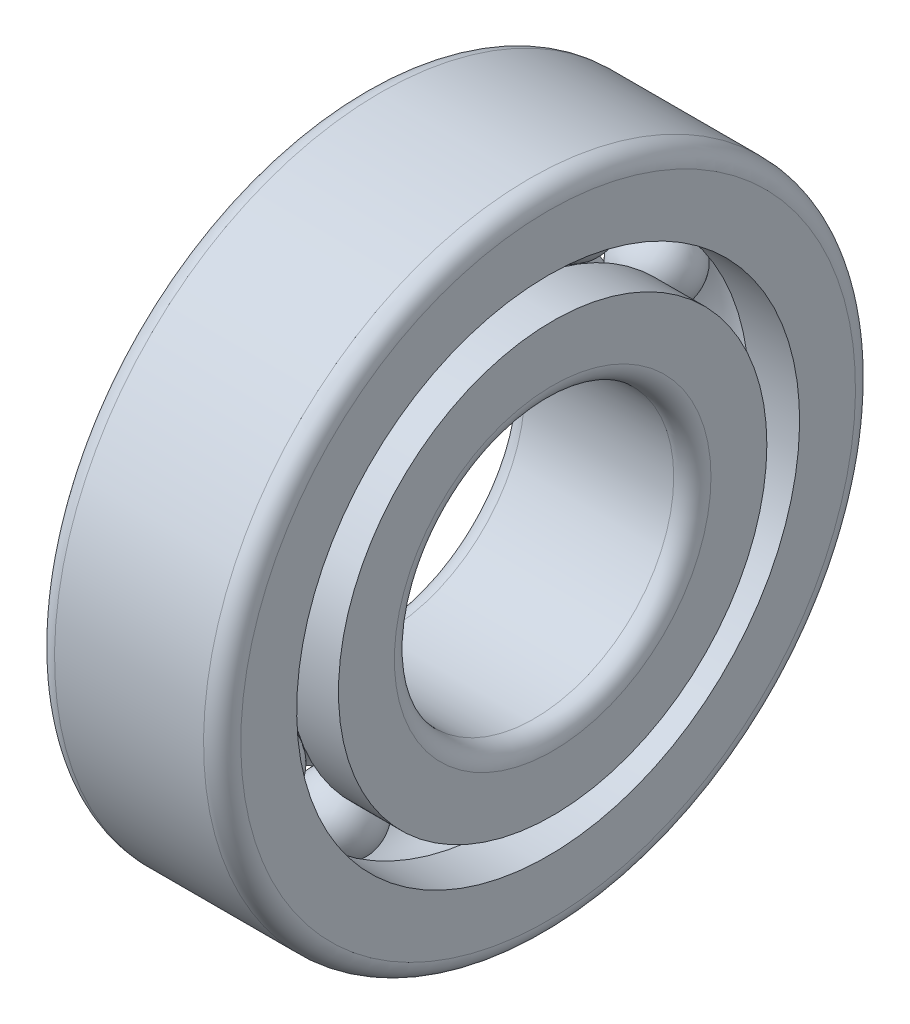
ISO-10303-21;
HEADER;
FILE_DESCRIPTION(('STEP AP214'),'2;1');
FILE_NAME('part.step','',(''),(''),'','','');
FILE_SCHEMA(('AUTOMOTIVE_DESIGN { 1 0 10303 214 1 1 1 1 }'));
ENDSEC;
DATA;
#1=APPLICATION_CONTEXT('core data for automotive mechanical design processes');
#2=APPLICATION_PROTOCOL_DEFINITION('international standard','automotive_design',2000,#1);
#3=PRODUCT_CONTEXT('',#1,'mechanical');
#4=PRODUCT('Part','Part','',(#3));
#5=PRODUCT_RELATED_PRODUCT_CATEGORY('part','',(#4));
#6=PRODUCT_DEFINITION_FORMATION('','',#4);
#7=PRODUCT_DEFINITION_CONTEXT('part definition',#1,'design');
#8=PRODUCT_DEFINITION('design','',#6,#7);
#9=PRODUCT_DEFINITION_SHAPE('','',#8);
#10=(LENGTH_UNIT() NAMED_UNIT(*) SI_UNIT(.MILLI.,.METRE.));
#11=(NAMED_UNIT(*) PLANE_ANGLE_UNIT() SI_UNIT($,.RADIAN.));
#12=(NAMED_UNIT(*) SI_UNIT($,.STERADIAN.) SOLID_ANGLE_UNIT());
#13=UNCERTAINTY_MEASURE_WITH_UNIT(LENGTH_MEASURE(1.E-05),#10,'distance_accuracy_value','');
#14=(GEOMETRIC_REPRESENTATION_CONTEXT(3) GLOBAL_UNCERTAINTY_ASSIGNED_CONTEXT((#13)) GLOBAL_UNIT_ASSIGNED_CONTEXT((#10,
#11,#12)) REPRESENTATION_CONTEXT('',''));
#15=CARTESIAN_POINT('',(0.,0.,0.));
#16=DIRECTION('',(0.,0.,1.));
#17=DIRECTION('',(1.,0.,0.));
#18=AXIS2_PLACEMENT_3D('',#15,#16,#17);
#19=CARTESIAN_POINT('',(0.,6.2499999999999,-10.8253175473055));
#20=DIRECTION('',(1.,0.,0.));
#21=DIRECTION('',(0.,-0.499999999999992,0.866025403784443));
#22=AXIS2_PLACEMENT_3D('',#19,#20,#21);
#23=SPHERICAL_SURFACE('',#22,2.);
#24=CARTESIAN_POINT('',(2.,6.2499999999999,-10.8253175473055));
#25=VERTEX_POINT('',#24);
#26=VERTEX_LOOP('',#25);
#27=FACE_BOUND('',#26,.T.);
#28=ADVANCED_FACE('P0_F13',(#27),#23,.T.);
#29=CLOSED_SHELL('',(#28));
#30=MANIFOLD_SOLID_BREP('P0_B1',#29);
#31=CARTESIAN_POINT('',(0.,-1.30930550206618E-13,-12.5));
#32=DIRECTION('',(1.,0.,0.));
#33=DIRECTION('',(0.,0.,1.));
#34=AXIS2_PLACEMENT_3D('',#31,#32,#33);
#35=SPHERICAL_SURFACE('',#34,2.);
#36=CARTESIAN_POINT('',(2.,-1.30930550206618E-13,-12.5));
#37=VERTEX_POINT('',#36);
#38=VERTEX_LOOP('',#37);
#39=FACE_BOUND('',#38,.T.);
#40=ADVANCED_FACE('P1_F13',(#39),#35,.T.);
#41=CLOSED_SHELL('',(#40));
#42=MANIFOLD_SOLID_BREP('P1_B1',#41);
#43=CARTESIAN_POINT('',(0.,-6.25000000000013,-10.8253175473054));
#44=DIRECTION('',(1.,0.,0.));
#45=DIRECTION('',(0.,0.50000000000001,0.866025403784433));
#46=AXIS2_PLACEMENT_3D('',#43,#44,#45);
#47=SPHERICAL_SURFACE('',#46,2.);
#48=CARTESIAN_POINT('',(2.,-6.25000000000013,-10.8253175473054));
#49=VERTEX_POINT('',#48);
#50=VERTEX_LOOP('',#49);
#51=FACE_BOUND('',#50,.T.);
#52=ADVANCED_FACE('P2_F13',(#51),#47,.T.);
#53=CLOSED_SHELL('',(#52));
#54=MANIFOLD_SOLID_BREP('P2_B1',#53);
#55=CARTESIAN_POINT('',(0.,-10.8253175473056,-6.24999999999986));
#56=DIRECTION('',(1.,0.,0.));
#57=DIRECTION('',(0.,0.866025403784445,0.499999999999989));
#58=AXIS2_PLACEMENT_3D('',#55,#56,#57);
#59=SPHERICAL_SURFACE('',#58,2.);
#60=CARTESIAN_POINT('',(2.,-10.8253175473056,-6.24999999999986));
#61=VERTEX_POINT('',#60);
#62=VERTEX_LOOP('',#61);
#63=FACE_BOUND('',#62,.T.);
#64=ADVANCED_FACE('P3_F12',(#63),#59,.T.);
#65=CLOSED_SHELL('',(#64));
#66=MANIFOLD_SOLID_BREP('P3_B1',#65);
#67=CARTESIAN_POINT('',(0.,-12.5,0.));
#68=DIRECTION('',(1.,0.,0.));
#69=DIRECTION('',(0.,1.,0.));
#70=AXIS2_PLACEMENT_3D('',#67,#68,#69);
#71=SPHERICAL_SURFACE('',#70,2.);
#72=CARTESIAN_POINT('',(2.,-12.5,0.));
#73=VERTEX_POINT('',#72);
#74=VERTEX_LOOP('',#73);
#75=FACE_BOUND('',#74,.T.);
#76=ADVANCED_FACE('P4_F13',(#75),#71,.T.);
#77=CLOSED_SHELL('',(#76));
#78=MANIFOLD_SOLID_BREP('P4_B1',#77);
#79=CARTESIAN_POINT('',(0.,-10.8253175473055,6.25000000000001));
#80=DIRECTION('',(1.,0.,0.));
#81=DIRECTION('',(0.,0.866025403784438,-0.500000000000001));
#82=AXIS2_PLACEMENT_3D('',#79,#80,#81);
#83=SPHERICAL_SURFACE('',#82,2.);
#84=CARTESIAN_POINT('',(2.,-10.8253175473055,6.25000000000001));
#85=VERTEX_POINT('',#84);
#86=VERTEX_LOOP('',#85);
#87=FACE_BOUND('',#86,.T.);
#88=ADVANCED_FACE('P5_F13',(#87),#83,.T.);
#89=CLOSED_SHELL('',(#88));
#90=MANIFOLD_SOLID_BREP('P5_B1',#89);
#91=CARTESIAN_POINT('',(0.,-6.24999999999998,10.8253175473055));
#92=DIRECTION('',(1.,0.,0.));
#93=DIRECTION('',(0.,0.499999999999998,-0.86602540378444));
#94=AXIS2_PLACEMENT_3D('',#91,#92,#93);
#95=SPHERICAL_SURFACE('',#94,2.);
#96=CARTESIAN_POINT('',(2.,-6.24999999999998,10.8253175473055));
#97=VERTEX_POINT('',#96);
#98=VERTEX_LOOP('',#97);
#99=FACE_BOUND('',#98,.T.);
#100=ADVANCED_FACE('P6_F13',(#99),#95,.T.);
#101=CLOSED_SHELL('',(#100));
#102=MANIFOLD_SOLID_BREP('P6_B1',#101);
#103=CARTESIAN_POINT('',(0.,0.,12.5));
#104=DIRECTION('',(1.,0.,0.));
#105=DIRECTION('',(0.,0.,-1.));
#106=AXIS2_PLACEMENT_3D('',#103,#104,#105);
#107=SPHERICAL_SURFACE('',#106,2.);
#108=CARTESIAN_POINT('',(2.,0.,12.5));
#109=VERTEX_POINT('',#108);
#110=VERTEX_LOOP('',#109);
#111=FACE_BOUND('',#110,.T.);
#112=ADVANCED_FACE('P7_F13',(#111),#107,.T.);
#113=CLOSED_SHELL('',(#112));
#114=MANIFOLD_SOLID_BREP('P7_B1',#113);
#115=CARTESIAN_POINT('',(0.,6.25000000000005,10.8253175473055));
#116=DIRECTION('',(1.,0.,0.));
#117=DIRECTION('',(0.,-0.500000000000004,-0.866025403784436));
#118=AXIS2_PLACEMENT_3D('',#115,#116,#117);
#119=SPHERICAL_SURFACE('',#118,2.);
#120=CARTESIAN_POINT('',(2.,6.25000000000005,10.8253175473055));
#121=VERTEX_POINT('',#120);
#122=VERTEX_LOOP('',#121);
#123=FACE_BOUND('',#122,.T.);
#124=ADVANCED_FACE('P8_F13',(#123),#119,.T.);
#125=CLOSED_SHELL('',(#124));
#126=MANIFOLD_SOLID_BREP('P8_B1',#125);
#127=CARTESIAN_POINT('',(0.,10.8253175473055,6.24999999999994));
#128=DIRECTION('',(1.,0.,0.));
#129=DIRECTION('',(0.,-0.866025403784442,-0.499999999999995));
#130=AXIS2_PLACEMENT_3D('',#127,#128,#129);
#131=SPHERICAL_SURFACE('',#130,2.);
#132=CARTESIAN_POINT('',(2.,10.8253175473055,6.24999999999994));
#133=VERTEX_POINT('',#132);
#134=VERTEX_LOOP('',#133);
#135=FACE_BOUND('',#134,.T.);
#136=ADVANCED_FACE('P9_F13',(#135),#131,.T.);
#137=CLOSED_SHELL('',(#136));
#138=MANIFOLD_SOLID_BREP('P9_B1',#137);
#139=CARTESIAN_POINT('',(0.,12.5,0.));
#140=DIRECTION('',(1.,0.,0.));
#141=DIRECTION('',(0.,-1.,0.));
#142=AXIS2_PLACEMENT_3D('',#139,#140,#141);
#143=SPHERICAL_SURFACE('',#142,2.);
#144=CARTESIAN_POINT('',(2.,12.5,0.));
#145=VERTEX_POINT('',#144);
#146=VERTEX_LOOP('',#145);
#147=FACE_BOUND('',#146,.T.);
#148=ADVANCED_FACE('P10_F13',(#147),#143,.T.);
#149=CLOSED_SHELL('',(#148));
#150=MANIFOLD_SOLID_BREP('P10_B1',#149);
#151=CARTESIAN_POINT('',(0.,10.8253175473054,-6.25000000000009));
#152=DIRECTION('',(1.,0.,0.));
#153=DIRECTION('',(0.,-0.866025403784435,0.500000000000007));
#154=AXIS2_PLACEMENT_3D('',#151,#152,#153);
#155=SPHERICAL_SURFACE('',#154,2.);
#156=CARTESIAN_POINT('',(2.,10.8253175473054,-6.25000000000009));
#157=VERTEX_POINT('',#156);
#158=VERTEX_LOOP('',#157);
#159=FACE_BOUND('',#158,.T.);
#160=ADVANCED_FACE('P11_F13',(#159),#155,.T.);
#161=CLOSED_SHELL('',(#160));
#162=MANIFOLD_SOLID_BREP('P11_B1',#161);
#163=CARTESIAN_POINT('',(0.243116963639805,0.,0.));
#164=DIRECTION('',(1.,0.,0.));
#165=DIRECTION('',(0.,0.,-1.));
#166=AXIS2_PLACEMENT_3D('',#163,#164,#165);
#167=TOROIDAL_SURFACE('',#166,12.5,2.5);
#168=CARTESIAN_POINT('',(2.53440481111773,0.,0.));
#169=DIRECTION('',(1.,0.,0.));
#170=DIRECTION('',(0.,0.,-1.));
#171=AXIS2_PLACEMENT_3D('',#168,#169,#170);
#172=CIRCLE('',#171,11.5);
#173=CARTESIAN_POINT('',(2.53440481111773,0.,-11.5));
#174=VERTEX_POINT('',#173);
#175=EDGE_CURVE('P12_E10',#174,#174,#172,.T.);
#176=ORIENTED_EDGE('',*,*,#175,.F.);
#177=EDGE_LOOP('',(#176));
#178=FACE_BOUND('',#177,.T.);
#179=CARTESIAN_POINT('',(-2.04817088383812,0.,0.));
#180=DIRECTION('',(1.,0.,0.));
#181=DIRECTION('',(0.,0.,-1.));
#182=AXIS2_PLACEMENT_3D('',#179,#180,#181);
#183=CIRCLE('',#182,11.5);
#184=CARTESIAN_POINT('',(-2.04817088383812,0.,-11.5));
#185=VERTEX_POINT('',#184);
#186=EDGE_CURVE('P12_E43',#185,#185,#183,.T.);
#187=ORIENTED_EDGE('',*,*,#186,.T.);
#188=EDGE_LOOP('',(#187));
#189=FACE_BOUND('',#188,.T.);
#190=ADVANCED_FACE('P12_F15',(#178,#189),#167,.F.);
#191=CARTESIAN_POINT('',(16.5,0.,0.));
#192=DIRECTION('',(1.,0.,0.));
#193=DIRECTION('',(0.,0.,-1.));
#194=AXIS2_PLACEMENT_3D('',#191,#192,#193);
#195=CYLINDRICAL_SURFACE('',#194,11.5);
#196=CARTESIAN_POINT('',(5.2431169636398,0.,0.));
#197=DIRECTION('',(1.,0.,0.));
#198=DIRECTION('',(0.,0.,-1.));
#199=AXIS2_PLACEMENT_3D('',#196,#197,#198);
#200=CIRCLE('',#199,11.5);
#201=CARTESIAN_POINT('',(5.2431169636398,0.,-11.5));
#202=VERTEX_POINT('',#201);
#203=EDGE_CURVE('P12_E21',#202,#202,#200,.T.);
#204=ORIENTED_EDGE('',*,*,#203,.F.);
#205=EDGE_LOOP('',(#204));
#206=FACE_BOUND('',#205,.T.);
#207=ORIENTED_EDGE('',*,*,#175,.T.);
#208=EDGE_LOOP('',(#207));
#209=FACE_BOUND('',#208,.T.);
#210=ADVANCED_FACE('P12_F80',(#206,#209),#195,.T.);
#211=CARTESIAN_POINT('',(5.2431169636398,0.,11.5));
#212=DIRECTION('',(-1.,0.,0.));
#213=DIRECTION('',(0.,0.,1.));
#214=AXIS2_PLACEMENT_3D('',#211,#212,#213);
#215=PLANE('',#214);
#216=CARTESIAN_POINT('',(5.2431169636398,0.,0.));
#217=DIRECTION('',(1.,0.,0.));
#218=DIRECTION('',(0.,0.,-1.));
#219=AXIS2_PLACEMENT_3D('',#216,#217,#218);
#220=CIRCLE('',#219,8.50000000000001);
#221=CARTESIAN_POINT('',(5.2431169636398,0.,-8.50000000000001));
#222=VERTEX_POINT('',#221);
#223=EDGE_CURVE('P12_E25',#222,#222,#220,.T.);
#224=ORIENTED_EDGE('',*,*,#223,.F.);
#225=EDGE_LOOP('',(#224));
#226=FACE_BOUND('',#225,.T.);
#227=ORIENTED_EDGE('',*,*,#203,.T.);
#228=EDGE_LOOP('',(#227));
#229=FACE_BOUND('',#228,.T.);
#230=ADVANCED_FACE('P12_F75',(#226,#229),#215,.F.);
#231=CARTESIAN_POINT('',(4.2431169636398,0.,0.));
#232=DIRECTION('',(1.,0.,0.));
#233=DIRECTION('',(0.,0.,-1.));
#234=AXIS2_PLACEMENT_3D('',#231,#232,#233);
#235=TOROIDAL_SURFACE('',#234,8.5,1.);
#236=CARTESIAN_POINT('',(4.2431169636398,0.,0.));
#237=DIRECTION('',(1.,0.,0.));
#238=DIRECTION('',(0.,0.,-1.));
#239=AXIS2_PLACEMENT_3D('',#236,#237,#238);
#240=CIRCLE('',#239,7.5);
#241=CARTESIAN_POINT('',(4.2431169636398,0.,-7.5));
#242=VERTEX_POINT('',#241);
#243=EDGE_CURVE('P12_E29',#242,#242,#240,.T.);
#244=ORIENTED_EDGE('',*,*,#243,.F.);
#245=EDGE_LOOP('',(#244));
#246=FACE_BOUND('',#245,.T.);
#247=ORIENTED_EDGE('',*,*,#223,.T.);
#248=EDGE_LOOP('',(#247));
#249=FACE_BOUND('',#248,.T.);
#250=ADVANCED_FACE('P12_F69',(#246,#249),#235,.T.);
#251=CARTESIAN_POINT('',(16.5,0.,0.));
#252=DIRECTION('',(1.,0.,0.));
#253=DIRECTION('',(0.,0.,-1.));
#254=AXIS2_PLACEMENT_3D('',#251,#252,#253);
#255=CYLINDRICAL_SURFACE('',#254,7.5);
#256=CARTESIAN_POINT('',(-3.75688303636019,0.,0.));
#257=DIRECTION('',(1.,0.,0.));
#258=DIRECTION('',(0.,0.,-1.));
#259=AXIS2_PLACEMENT_3D('',#256,#257,#258);
#260=CIRCLE('',#259,7.5);
#261=CARTESIAN_POINT('',(-3.75688303636019,0.,-7.5));
#262=VERTEX_POINT('',#261);
#263=EDGE_CURVE('P12_E34',#262,#262,#260,.T.);
#264=ORIENTED_EDGE('',*,*,#263,.F.);
#265=EDGE_LOOP('',(#264));
#266=FACE_BOUND('',#265,.T.);
#267=ORIENTED_EDGE('',*,*,#243,.T.);
#268=EDGE_LOOP('',(#267));
#269=FACE_BOUND('',#268,.T.);
#270=ADVANCED_FACE('P12_F63',(#266,#269),#255,.F.);
#271=CARTESIAN_POINT('',(-3.7568830363602,0.,0.));
#272=DIRECTION('',(1.,0.,0.));
#273=DIRECTION('',(0.,0.,-1.));
#274=AXIS2_PLACEMENT_3D('',#271,#272,#273);
#275=TOROIDAL_SURFACE('',#274,8.5,0.999999999999999);
#276=CARTESIAN_POINT('',(-4.75688303636019,0.,0.));
#277=DIRECTION('',(1.,0.,0.));
#278=DIRECTION('',(0.,0.,-1.));
#279=AXIS2_PLACEMENT_3D('',#276,#277,#278);
#280=CIRCLE('',#279,8.50000000000001);
#281=CARTESIAN_POINT('',(-4.75688303636019,0.,-8.50000000000001));
#282=VERTEX_POINT('',#281);
#283=EDGE_CURVE('P12_E37',#282,#282,#280,.T.);
#284=ORIENTED_EDGE('',*,*,#283,.F.);
#285=EDGE_LOOP('',(#284));
#286=FACE_BOUND('',#285,.T.);
#287=ORIENTED_EDGE('',*,*,#263,.T.);
#288=EDGE_LOOP('',(#287));
#289=FACE_BOUND('',#288,.T.);
#290=ADVANCED_FACE('P12_F57',(#286,#289),#275,.T.);
#291=CARTESIAN_POINT('',(-4.75688303636019,0.,11.5));
#292=DIRECTION('',(1.,0.,0.));
#293=DIRECTION('',(0.,0.,-1.));
#294=AXIS2_PLACEMENT_3D('',#291,#292,#293);
#295=PLANE('',#294);
#296=CARTESIAN_POINT('',(-4.75688303636019,0.,0.));
#297=DIRECTION('',(1.,0.,0.));
#298=DIRECTION('',(0.,0.,-1.));
#299=AXIS2_PLACEMENT_3D('',#296,#297,#298);
#300=CIRCLE('',#299,11.5);
#301=CARTESIAN_POINT('',(-4.75688303636019,0.,-11.5));
#302=VERTEX_POINT('',#301);
#303=EDGE_CURVE('P12_E40',#302,#302,#300,.T.);
#304=ORIENTED_EDGE('',*,*,#303,.F.);
#305=EDGE_LOOP('',(#304));
#306=FACE_BOUND('',#305,.T.);
#307=ORIENTED_EDGE('',*,*,#283,.T.);
#308=EDGE_LOOP('',(#307));
#309=FACE_BOUND('',#308,.T.);
#310=ADVANCED_FACE('P12_F51',(#306,#309),#295,.F.);
#311=CARTESIAN_POINT('',(16.5,0.,0.));
#312=DIRECTION('',(1.,0.,0.));
#313=DIRECTION('',(0.,0.,-1.));
#314=AXIS2_PLACEMENT_3D('',#311,#312,#313);
#315=CYLINDRICAL_SURFACE('',#314,11.5);
#316=ORIENTED_EDGE('',*,*,#186,.F.);
#317=EDGE_LOOP('',(#316));
#318=FACE_BOUND('',#317,.T.);
#319=ORIENTED_EDGE('',*,*,#303,.T.);
#320=EDGE_LOOP('',(#319));
#321=FACE_BOUND('',#320,.T.);
#322=ADVANCED_FACE('P12_F48',(#318,#321),#315,.T.);
#323=CLOSED_SHELL('',(#190,#210,#230,#250,#270,#290,#310,#322));
#324=MANIFOLD_SOLID_BREP('P12_B1',#323);
#325=CARTESIAN_POINT('',(-30.4352843281218,0.,0.));
#326=DIRECTION('',(-1.,0.,0.));
#327=DIRECTION('',(0.,1.,0.));
#328=AXIS2_PLACEMENT_3D('',#325,#326,#327);
#329=CYLINDRICAL_SURFACE('',#328,13.5);
#330=CARTESIAN_POINT('',(-2.29128784747792,0.,0.));
#331=DIRECTION('',(-1.,0.,0.));
#332=DIRECTION('',(0.,1.,0.));
#333=AXIS2_PLACEMENT_3D('',#330,#331,#332);
#334=CIRCLE('',#333,13.5);
#335=CARTESIAN_POINT('',(-2.29128784747792,13.5,0.));
#336=VERTEX_POINT('',#335);
#337=EDGE_CURVE('P13_E9',#336,#336,#334,.T.);
#338=ORIENTED_EDGE('',*,*,#337,.F.);
#339=EDGE_LOOP('',(#338));
#340=FACE_BOUND('',#339,.T.);
#341=CARTESIAN_POINT('',(-5.,0.,0.));
#342=DIRECTION('',(-1.,0.,0.));
#343=DIRECTION('',(0.,1.,0.));
#344=AXIS2_PLACEMENT_3D('',#341,#342,#343);
#345=CIRCLE('',#344,13.5);
#346=CARTESIAN_POINT('',(-5.,13.5,0.));
#347=VERTEX_POINT('',#346);
#348=EDGE_CURVE('P13_E42',#347,#347,#345,.T.);
#349=ORIENTED_EDGE('',*,*,#348,.T.);
#350=EDGE_LOOP('',(#349));
#351=FACE_BOUND('',#350,.T.);
#352=ADVANCED_FACE('P13_F14',(#340,#351),#329,.F.);
#353=CARTESIAN_POINT('',(0.,0.,0.));
#354=DIRECTION('',(-1.,0.,0.));
#355=DIRECTION('',(0.,1.,0.));
#356=AXIS2_PLACEMENT_3D('',#353,#354,#355);
#357=TOROIDAL_SURFACE('',#356,12.5,2.5);
#358=CARTESIAN_POINT('',(2.29128784747792,0.,0.));
#359=DIRECTION('',(-1.,0.,0.));
#360=DIRECTION('',(0.,1.,0.));
#361=AXIS2_PLACEMENT_3D('',#358,#359,#360);
#362=CIRCLE('',#361,13.5);
#363=CARTESIAN_POINT('',(2.29128784747792,13.5,0.));
#364=VERTEX_POINT('',#363);
#365=EDGE_CURVE('P13_E20',#364,#364,#362,.T.);
#366=ORIENTED_EDGE('',*,*,#365,.F.);
#367=EDGE_LOOP('',(#366));
#368=FACE_BOUND('',#367,.T.);
#369=ORIENTED_EDGE('',*,*,#337,.T.);
#370=EDGE_LOOP('',(#369));
#371=FACE_BOUND('',#370,.T.);
#372=ADVANCED_FACE('P13_F79',(#368,#371),#357,.F.);
#373=CARTESIAN_POINT('',(-30.4352843281218,0.,0.));
#374=DIRECTION('',(-1.,0.,0.));
#375=DIRECTION('',(0.,1.,0.));
#376=AXIS2_PLACEMENT_3D('',#373,#374,#375);
#377=CYLINDRICAL_SURFACE('',#376,13.5);
#378=CARTESIAN_POINT('',(5.,0.,0.));
#379=DIRECTION('',(-1.,0.,0.));
#380=DIRECTION('',(0.,1.,0.));
#381=AXIS2_PLACEMENT_3D('',#378,#379,#380);
#382=CIRCLE('',#381,13.5);
#383=CARTESIAN_POINT('',(5.,13.5,0.));
#384=VERTEX_POINT('',#383);
#385=EDGE_CURVE('P13_E24',#384,#384,#382,.T.);
#386=ORIENTED_EDGE('',*,*,#385,.F.);
#387=EDGE_LOOP('',(#386));
#388=FACE_BOUND('',#387,.T.);
#389=ORIENTED_EDGE('',*,*,#365,.T.);
#390=EDGE_LOOP('',(#389));
#391=FACE_BOUND('',#390,.T.);
#392=ADVANCED_FACE('P13_F74',(#388,#391),#377,.F.);
#393=CARTESIAN_POINT('',(5.,-16.5,0.));
#394=DIRECTION('',(-1.,0.,0.));
#395=DIRECTION('',(0.,1.,0.));
#396=AXIS2_PLACEMENT_3D('',#393,#394,#395);
#397=PLANE('',#396);
#398=CARTESIAN_POINT('',(5.,0.,0.));
#399=DIRECTION('',(-1.,0.,0.));
#400=DIRECTION('',(0.,1.,0.));
#401=AXIS2_PLACEMENT_3D('',#398,#399,#400);
#402=CIRCLE('',#401,16.5);
#403=CARTESIAN_POINT('',(5.,16.5,0.));
#404=VERTEX_POINT('',#403);
#405=EDGE_CURVE('P13_E28',#404,#404,#402,.T.);
#406=ORIENTED_EDGE('',*,*,#405,.F.);
#407=EDGE_LOOP('',(#406));
#408=FACE_BOUND('',#407,.T.);
#409=ORIENTED_EDGE('',*,*,#385,.T.);
#410=EDGE_LOOP('',(#409));
#411=FACE_BOUND('',#410,.T.);
#412=ADVANCED_FACE('P13_F68',(#408,#411),#397,.F.);
#413=CARTESIAN_POINT('',(4.,0.,0.));
#414=DIRECTION('',(-1.,0.,0.));
#415=DIRECTION('',(0.,1.,0.));
#416=AXIS2_PLACEMENT_3D('',#413,#414,#415);
#417=TOROIDAL_SURFACE('',#416,16.5,1.);
#418=CARTESIAN_POINT('',(3.99999999999999,0.,0.));
#419=DIRECTION('',(-1.,0.,0.));
#420=DIRECTION('',(0.,1.,0.));
#421=AXIS2_PLACEMENT_3D('',#418,#419,#420);
#422=CIRCLE('',#421,17.5);
#423=CARTESIAN_POINT('',(3.99999999999999,17.5,0.));
#424=VERTEX_POINT('',#423);
#425=EDGE_CURVE('P13_E33',#424,#424,#422,.T.);
#426=ORIENTED_EDGE('',*,*,#425,.F.);
#427=EDGE_LOOP('',(#426));
#428=FACE_BOUND('',#427,.T.);
#429=ORIENTED_EDGE('',*,*,#405,.T.);
#430=EDGE_LOOP('',(#429));
#431=FACE_BOUND('',#430,.T.);
#432=ADVANCED_FACE('P13_F62',(#428,#431),#417,.T.);
#433=CARTESIAN_POINT('',(-30.4352843281218,0.,0.));
#434=DIRECTION('',(-1.,0.,0.));
#435=DIRECTION('',(0.,1.,0.));
#436=AXIS2_PLACEMENT_3D('',#433,#434,#435);
#437=CYLINDRICAL_SURFACE('',#436,17.5);
#438=CARTESIAN_POINT('',(-3.99999999999999,0.,0.));
#439=DIRECTION('',(-1.,0.,0.));
#440=DIRECTION('',(0.,1.,0.));
#441=AXIS2_PLACEMENT_3D('',#438,#439,#440);
#442=CIRCLE('',#441,17.5);
#443=CARTESIAN_POINT('',(-3.99999999999999,17.5,0.));
#444=VERTEX_POINT('',#443);
#445=EDGE_CURVE('P13_E36',#444,#444,#442,.T.);
#446=ORIENTED_EDGE('',*,*,#445,.F.);
#447=EDGE_LOOP('',(#446));
#448=FACE_BOUND('',#447,.T.);
#449=ORIENTED_EDGE('',*,*,#425,.T.);
#450=EDGE_LOOP('',(#449));
#451=FACE_BOUND('',#450,.T.);
#452=ADVANCED_FACE('P13_F56',(#448,#451),#437,.T.);
#453=CARTESIAN_POINT('',(-4.,0.,0.));
#454=DIRECTION('',(-1.,0.,0.));
#455=DIRECTION('',(0.,1.,0.));
#456=AXIS2_PLACEMENT_3D('',#453,#454,#455);
#457=TOROIDAL_SURFACE('',#456,16.5,1.);
#458=CARTESIAN_POINT('',(-5.,0.,0.));
#459=DIRECTION('',(-1.,0.,0.));
#460=DIRECTION('',(0.,1.,0.));
#461=AXIS2_PLACEMENT_3D('',#458,#459,#460);
#462=CIRCLE('',#461,16.5);
#463=CARTESIAN_POINT('',(-5.,16.5,0.));
#464=VERTEX_POINT('',#463);
#465=EDGE_CURVE('P13_E39',#464,#464,#462,.T.);
#466=ORIENTED_EDGE('',*,*,#465,.F.);
#467=EDGE_LOOP('',(#466));
#468=FACE_BOUND('',#467,.T.);
#469=ORIENTED_EDGE('',*,*,#445,.T.);
#470=EDGE_LOOP('',(#469));
#471=FACE_BOUND('',#470,.T.);
#472=ADVANCED_FACE('P13_F50',(#468,#471),#457,.T.);
#473=CARTESIAN_POINT('',(-5.,-16.5,0.));
#474=DIRECTION('',(1.,0.,0.));
#475=DIRECTION('',(0.,-1.,0.));
#476=AXIS2_PLACEMENT_3D('',#473,#474,#475);
#477=PLANE('',#476);
#478=ORIENTED_EDGE('',*,*,#348,.F.);
#479=EDGE_LOOP('',(#478));
#480=FACE_BOUND('',#479,.T.);
#481=ORIENTED_EDGE('',*,*,#465,.T.);
#482=EDGE_LOOP('',(#481));
#483=FACE_BOUND('',#482,.T.);
#484=ADVANCED_FACE('P13_F47',(#480,#483),#477,.F.);
#485=CLOSED_SHELL('',(#352,#372,#392,#412,#432,#452,#472,#484));
#486=MANIFOLD_SOLID_BREP('P13_B1',#485);
#487=ADVANCED_BREP_SHAPE_REPRESENTATION('',(#18,#30,#42,#54,#66,#78,#90,#102,#114,#126,#138,
#150,#162,#324,#486),#14);
#488=SHAPE_DEFINITION_REPRESENTATION(#9,#487);
ENDSEC;
END-ISO-10303-21;
